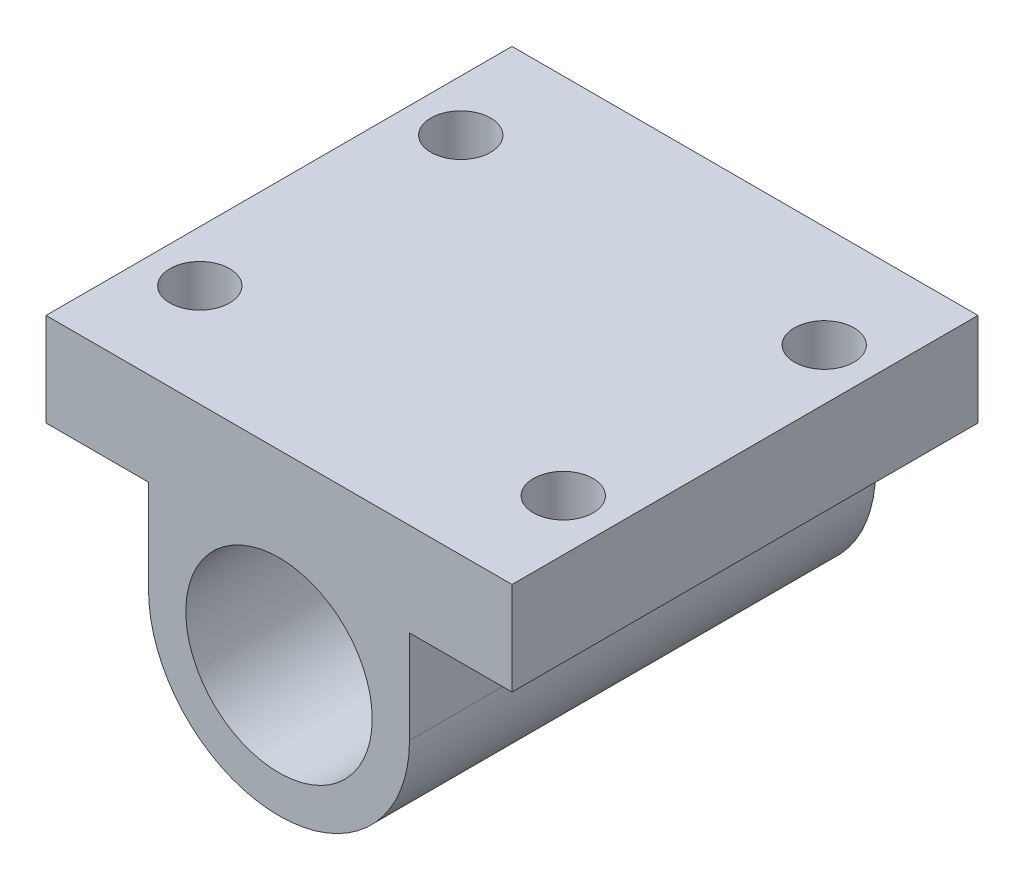
ISO-10303-21;
HEADER;
FILE_DESCRIPTION(('STEP AP214'),'2;1');
FILE_NAME('part.step','',(''),(''),'','','');
FILE_SCHEMA(('AUTOMOTIVE_DESIGN { 1 0 10303 214 1 1 1 1 }'));
ENDSEC;
DATA;
#1=APPLICATION_CONTEXT('core data for automotive mechanical design processes');
#2=APPLICATION_PROTOCOL_DEFINITION('international standard','automotive_design',2000,#1);
#3=PRODUCT_CONTEXT('',#1,'mechanical');
#4=PRODUCT('Part','Part','',(#3));
#5=PRODUCT_RELATED_PRODUCT_CATEGORY('part','',(#4));
#6=PRODUCT_DEFINITION_FORMATION('','',#4);
#7=PRODUCT_DEFINITION_CONTEXT('part definition',#1,'design');
#8=PRODUCT_DEFINITION('design','',#6,#7);
#9=PRODUCT_DEFINITION_SHAPE('','',#8);
#10=(LENGTH_UNIT() NAMED_UNIT(*) SI_UNIT(.MILLI.,.METRE.));
#11=(NAMED_UNIT(*) PLANE_ANGLE_UNIT() SI_UNIT($,.RADIAN.));
#12=(NAMED_UNIT(*) SI_UNIT($,.STERADIAN.) SOLID_ANGLE_UNIT());
#13=UNCERTAINTY_MEASURE_WITH_UNIT(LENGTH_MEASURE(1.E-05),#10,'distance_accuracy_value','');
#14=(GEOMETRIC_REPRESENTATION_CONTEXT(3) GLOBAL_UNCERTAINTY_ASSIGNED_CONTEXT((#13)) GLOBAL_UNIT_ASSIGNED_CONTEXT((#10,
#11,#12)) REPRESENTATION_CONTEXT('',''));
#15=CARTESIAN_POINT('',(0.,0.,0.));
#16=DIRECTION('',(0.,0.,1.));
#17=DIRECTION('',(1.,0.,0.));
#18=AXIS2_PLACEMENT_3D('',#15,#16,#17);
#19=CARTESIAN_POINT('',(0.,-5.,25.));
#20=DIRECTION('',(0.,0.,1.));
#21=DIRECTION('',(1.,0.,0.));
#22=AXIS2_PLACEMENT_3D('',#19,#20,#21);
#23=PLANE('',#22);
#24=DIRECTION('',(0.,-1.,0.));
#25=VECTOR('',#24,1.);
#26=CARTESIAN_POINT('',(-12.5,5.,25.));
#27=LINE('',#26,#25);
#28=CARTESIAN_POINT('',(-12.5,5.,25.));
#29=VERTEX_POINT('',#28);
#30=CARTESIAN_POINT('',(-12.5,0.,25.));
#31=VERTEX_POINT('',#30);
#32=EDGE_CURVE('E170',#29,#31,#27,.T.);
#33=ORIENTED_EDGE('',*,*,#32,.T.);
#34=DIRECTION('',(1.,0.,0.));
#35=VECTOR('',#34,1.);
#36=CARTESIAN_POINT('',(-12.5,0.,25.));
#37=LINE('',#36,#35);
#38=CARTESIAN_POINT('',(-7.,0.,25.));
#39=VERTEX_POINT('',#38);
#40=EDGE_CURVE('E106',#31,#39,#37,.T.);
#41=ORIENTED_EDGE('',*,*,#40,.T.);
#42=DIRECTION('',(0.,-1.,0.));
#43=VECTOR('',#42,1.);
#44=CARTESIAN_POINT('',(-7.,-5.,25.));
#45=LINE('',#44,#43);
#46=CARTESIAN_POINT('',(-7.,-5.,25.));
#47=VERTEX_POINT('',#46);
#48=EDGE_CURVE('E191',#39,#47,#45,.T.);
#49=ORIENTED_EDGE('',*,*,#48,.T.);
#50=CARTESIAN_POINT('',(0.,-5.,25.));
#51=DIRECTION('',(0.,0.,1.));
#52=DIRECTION('',(1.,0.,0.));
#53=AXIS2_PLACEMENT_3D('',#50,#51,#52);
#54=CIRCLE('',#53,7.);
#55=CARTESIAN_POINT('',(7.,-5.,25.));
#56=VERTEX_POINT('',#55);
#57=EDGE_CURVE('E205',#47,#56,#54,.T.);
#58=ORIENTED_EDGE('',*,*,#57,.T.);
#59=DIRECTION('',(0.,1.,0.));
#60=VECTOR('',#59,1.);
#61=CARTESIAN_POINT('',(7.,-5.,25.));
#62=LINE('',#61,#60);
#63=CARTESIAN_POINT('',(7.,0.,25.));
#64=VERTEX_POINT('',#63);
#65=EDGE_CURVE('E125',#56,#64,#62,.T.);
#66=ORIENTED_EDGE('',*,*,#65,.T.);
#67=DIRECTION('',(1.,0.,0.));
#68=VECTOR('',#67,1.);
#69=CARTESIAN_POINT('',(7.,0.,25.));
#70=LINE('',#69,#68);
#71=CARTESIAN_POINT('',(12.5,0.,25.));
#72=VERTEX_POINT('',#71);
#73=EDGE_CURVE('E119',#64,#72,#70,.T.);
#74=ORIENTED_EDGE('',*,*,#73,.T.);
#75=DIRECTION('',(0.,1.,0.));
#76=VECTOR('',#75,1.);
#77=CARTESIAN_POINT('',(12.5,5.,25.));
#78=LINE('',#77,#76);
#79=CARTESIAN_POINT('',(12.5,5.,25.));
#80=VERTEX_POINT('',#79);
#81=EDGE_CURVE('E123',#72,#80,#78,.T.);
#82=ORIENTED_EDGE('',*,*,#81,.T.);
#83=DIRECTION('',(-1.,0.,0.));
#84=VECTOR('',#83,1.);
#85=CARTESIAN_POINT('',(-12.5,5.,25.));
#86=LINE('',#85,#84);
#87=EDGE_CURVE('E63',#80,#29,#86,.T.);
#88=ORIENTED_EDGE('',*,*,#87,.T.);
#89=EDGE_LOOP('',(#33,#41,#49,#58,#66,#74,#82,#88));
#90=FACE_BOUND('',#89,.T.);
#91=CARTESIAN_POINT('',(0.,-5.,25.));
#92=DIRECTION('',(0.,0.,1.));
#93=DIRECTION('',(1.,0.,0.));
#94=AXIS2_PLACEMENT_3D('',#91,#92,#93);
#95=CIRCLE('',#94,5.);
#96=CARTESIAN_POINT('',(5.,-5.,25.));
#97=VERTEX_POINT('',#96);
#98=EDGE_CURVE('E152',#97,#97,#95,.T.);
#99=ORIENTED_EDGE('',*,*,#98,.F.);
#100=EDGE_LOOP('',(#99));
#101=FACE_BOUND('',#100,.T.);
#102=ADVANCED_FACE('F45',(#90,#101),#23,.T.);
#103=CARTESIAN_POINT('',(0.,-5.,0.));
#104=DIRECTION('',(0.,0.,1.));
#105=DIRECTION('',(1.,0.,0.));
#106=AXIS2_PLACEMENT_3D('',#103,#104,#105);
#107=PLANE('',#106);
#108=DIRECTION('',(0.,-1.,0.));
#109=VECTOR('',#108,1.);
#110=CARTESIAN_POINT('',(-12.5,5.,0.));
#111=LINE('',#110,#109);
#112=CARTESIAN_POINT('',(-12.5,5.,0.));
#113=VERTEX_POINT('',#112);
#114=CARTESIAN_POINT('',(-12.5,0.,0.));
#115=VERTEX_POINT('',#114);
#116=EDGE_CURVE('E147',#113,#115,#111,.T.);
#117=ORIENTED_EDGE('',*,*,#116,.F.);
#118=DIRECTION('',(-1.,0.,0.));
#119=VECTOR('',#118,1.);
#120=CARTESIAN_POINT('',(-12.5,5.,0.));
#121=LINE('',#120,#119);
#122=CARTESIAN_POINT('',(12.5,5.,0.));
#123=VERTEX_POINT('',#122);
#124=EDGE_CURVE('E98',#123,#113,#121,.T.);
#125=ORIENTED_EDGE('',*,*,#124,.F.);
#126=DIRECTION('',(0.,1.,0.));
#127=VECTOR('',#126,1.);
#128=CARTESIAN_POINT('',(12.5,5.,0.));
#129=LINE('',#128,#127);
#130=CARTESIAN_POINT('',(12.5,0.,0.));
#131=VERTEX_POINT('',#130);
#132=EDGE_CURVE('E92',#131,#123,#129,.T.);
#133=ORIENTED_EDGE('',*,*,#132,.F.);
#134=DIRECTION('',(1.,0.,0.));
#135=VECTOR('',#134,1.);
#136=CARTESIAN_POINT('',(7.,0.,0.));
#137=LINE('',#136,#135);
#138=CARTESIAN_POINT('',(7.,0.,0.));
#139=VERTEX_POINT('',#138);
#140=EDGE_CURVE('E134',#139,#131,#137,.T.);
#141=ORIENTED_EDGE('',*,*,#140,.F.);
#142=DIRECTION('',(0.,1.,0.));
#143=VECTOR('',#142,1.);
#144=CARTESIAN_POINT('',(7.,-5.,0.));
#145=LINE('',#144,#143);
#146=CARTESIAN_POINT('',(7.,-5.,0.));
#147=VERTEX_POINT('',#146);
#148=EDGE_CURVE('E161',#147,#139,#145,.T.);
#149=ORIENTED_EDGE('',*,*,#148,.F.);
#150=CARTESIAN_POINT('',(0.,-5.,0.));
#151=DIRECTION('',(0.,0.,1.));
#152=DIRECTION('',(1.,0.,0.));
#153=AXIS2_PLACEMENT_3D('',#150,#151,#152);
#154=CIRCLE('',#153,7.);
#155=CARTESIAN_POINT('',(-7.,-5.,0.));
#156=VERTEX_POINT('',#155);
#157=EDGE_CURVE('E158',#156,#147,#154,.T.);
#158=ORIENTED_EDGE('',*,*,#157,.F.);
#159=DIRECTION('',(0.,-1.,0.));
#160=VECTOR('',#159,1.);
#161=CARTESIAN_POINT('',(-7.,-5.,0.));
#162=LINE('',#161,#160);
#163=CARTESIAN_POINT('',(-7.,0.,0.));
#164=VERTEX_POINT('',#163);
#165=EDGE_CURVE('E155',#164,#156,#162,.T.);
#166=ORIENTED_EDGE('',*,*,#165,.F.);
#167=DIRECTION('',(1.,0.,0.));
#168=VECTOR('',#167,1.);
#169=CARTESIAN_POINT('',(-12.5,0.,0.));
#170=LINE('',#169,#168);
#171=EDGE_CURVE('E151',#115,#164,#170,.T.);
#172=ORIENTED_EDGE('',*,*,#171,.F.);
#173=EDGE_LOOP('',(#117,#125,#133,#141,#149,#158,#166,#172));
#174=FACE_BOUND('',#173,.T.);
#175=CARTESIAN_POINT('',(0.,-5.,0.));
#176=DIRECTION('',(0.,0.,1.));
#177=DIRECTION('',(1.,0.,0.));
#178=AXIS2_PLACEMENT_3D('',#175,#176,#177);
#179=CIRCLE('',#178,5.);
#180=CARTESIAN_POINT('',(5.,-5.,0.));
#181=VERTEX_POINT('',#180);
#182=EDGE_CURVE('E215',#181,#181,#179,.T.);
#183=ORIENTED_EDGE('',*,*,#182,.T.);
#184=EDGE_LOOP('',(#183));
#185=FACE_BOUND('',#184,.T.);
#186=ADVANCED_FACE('F195',(#174,#185),#107,.F.);
#187=CARTESIAN_POINT('',(-12.5,5.,25.));
#188=DIRECTION('',(1.,0.,0.));
#189=DIRECTION('',(0.,0.,-1.));
#190=AXIS2_PLACEMENT_3D('',#187,#188,#189);
#191=PLANE('',#190);
#192=ORIENTED_EDGE('',*,*,#116,.T.);
#193=DIRECTION('',(0.,0.,-1.));
#194=VECTOR('',#193,1.);
#195=CARTESIAN_POINT('',(-12.5,0.,25.));
#196=LINE('',#195,#194);
#197=EDGE_CURVE('E11',#31,#115,#196,.T.);
#198=ORIENTED_EDGE('',*,*,#197,.F.);
#199=ORIENTED_EDGE('',*,*,#32,.F.);
#200=DIRECTION('',(0.,0.,-1.));
#201=VECTOR('',#200,1.);
#202=CARTESIAN_POINT('',(-12.5,5.,25.));
#203=LINE('',#202,#201);
#204=EDGE_CURVE('E143',#29,#113,#203,.T.);
#205=ORIENTED_EDGE('',*,*,#204,.T.);
#206=EDGE_LOOP('',(#192,#198,#199,#205));
#207=FACE_BOUND('',#206,.T.);
#208=ADVANCED_FACE('F47',(#207),#191,.F.);
#209=CARTESIAN_POINT('',(-12.5,0.,25.));
#210=DIRECTION('',(0.,1.,0.));
#211=DIRECTION('',(0.,0.,1.));
#212=AXIS2_PLACEMENT_3D('',#209,#210,#211);
#213=PLANE('',#212);
#214=CARTESIAN_POINT('',(-9.75,0.,19.5));
#215=DIRECTION('',(0.,-1.,0.));
#216=DIRECTION('',(0.,0.,-1.));
#217=AXIS2_PLACEMENT_3D('',#214,#215,#216);
#218=CIRCLE('',#217,1.59999999999999);
#219=CARTESIAN_POINT('',(-9.75,0.,17.9));
#220=VERTEX_POINT('',#219);
#221=EDGE_CURVE('E250',#220,#220,#218,.T.);
#222=ORIENTED_EDGE('',*,*,#221,.F.);
#223=EDGE_LOOP('',(#222));
#224=FACE_BOUND('',#223,.T.);
#225=CARTESIAN_POINT('',(-9.75,0.,5.5));
#226=DIRECTION('',(0.,-1.,0.));
#227=DIRECTION('',(0.,0.,-1.));
#228=AXIS2_PLACEMENT_3D('',#225,#226,#227);
#229=CIRCLE('',#228,1.59999999999999);
#230=CARTESIAN_POINT('',(-9.75,0.,3.90000000000001));
#231=VERTEX_POINT('',#230);
#232=EDGE_CURVE('E242',#231,#231,#229,.T.);
#233=ORIENTED_EDGE('',*,*,#232,.F.);
#234=EDGE_LOOP('',(#233));
#235=FACE_BOUND('',#234,.T.);
#236=ORIENTED_EDGE('',*,*,#171,.T.);
#237=DIRECTION('',(0.,0.,-1.));
#238=VECTOR('',#237,1.);
#239=CARTESIAN_POINT('',(-7.,0.,25.));
#240=LINE('',#239,#238);
#241=EDGE_CURVE('E55',#39,#164,#240,.T.);
#242=ORIENTED_EDGE('',*,*,#241,.F.);
#243=ORIENTED_EDGE('',*,*,#40,.F.);
#244=ORIENTED_EDGE('',*,*,#197,.T.);
#245=EDGE_LOOP('',(#236,#242,#243,#244));
#246=FACE_BOUND('',#245,.T.);
#247=ADVANCED_FACE('F257',(#224,#235,#246),#213,.F.);
#248=CARTESIAN_POINT('',(-7.,-5.,25.));
#249=DIRECTION('',(1.,0.,0.));
#250=DIRECTION('',(0.,0.,-1.));
#251=AXIS2_PLACEMENT_3D('',#248,#249,#250);
#252=PLANE('',#251);
#253=ORIENTED_EDGE('',*,*,#165,.T.);
#254=DIRECTION('',(0.,0.,-1.));
#255=VECTOR('',#254,1.);
#256=CARTESIAN_POINT('',(-7.,-5.,25.));
#257=LINE('',#256,#255);
#258=EDGE_CURVE('E181',#47,#156,#257,.T.);
#259=ORIENTED_EDGE('',*,*,#258,.F.);
#260=ORIENTED_EDGE('',*,*,#48,.F.);
#261=ORIENTED_EDGE('',*,*,#241,.T.);
#262=EDGE_LOOP('',(#253,#259,#260,#261));
#263=FACE_BOUND('',#262,.T.);
#264=ADVANCED_FACE('F189',(#263),#252,.F.);
#265=CARTESIAN_POINT('',(0.,-5.,25.));
#266=DIRECTION('',(0.,0.,-1.));
#267=DIRECTION('',(-1.,0.,0.));
#268=AXIS2_PLACEMENT_3D('',#265,#266,#267);
#269=CYLINDRICAL_SURFACE('',#268,7.);
#270=ORIENTED_EDGE('',*,*,#157,.T.);
#271=DIRECTION('',(0.,0.,-1.));
#272=VECTOR('',#271,1.);
#273=CARTESIAN_POINT('',(7.,-5.,25.));
#274=LINE('',#273,#272);
#275=EDGE_CURVE('E177',#56,#147,#274,.T.);
#276=ORIENTED_EDGE('',*,*,#275,.F.);
#277=ORIENTED_EDGE('',*,*,#57,.F.);
#278=ORIENTED_EDGE('',*,*,#258,.T.);
#279=EDGE_LOOP('',(#270,#276,#277,#278));
#280=FACE_BOUND('',#279,.T.);
#281=ADVANCED_FACE('F200',(#280),#269,.T.);
#282=CARTESIAN_POINT('',(7.,-5.,25.));
#283=DIRECTION('',(-1.,0.,0.));
#284=DIRECTION('',(0.,-1.,0.));
#285=AXIS2_PLACEMENT_3D('',#282,#283,#284);
#286=PLANE('',#285);
#287=ORIENTED_EDGE('',*,*,#148,.T.);
#288=DIRECTION('',(0.,0.,-1.));
#289=VECTOR('',#288,1.);
#290=CARTESIAN_POINT('',(7.,0.,25.));
#291=LINE('',#290,#289);
#292=EDGE_CURVE('E136',#64,#139,#291,.T.);
#293=ORIENTED_EDGE('',*,*,#292,.F.);
#294=ORIENTED_EDGE('',*,*,#65,.F.);
#295=ORIENTED_EDGE('',*,*,#275,.T.);
#296=EDGE_LOOP('',(#287,#293,#294,#295));
#297=FACE_BOUND('',#296,.T.);
#298=ADVANCED_FACE('F203',(#297),#286,.F.);
#299=CARTESIAN_POINT('',(7.,0.,25.));
#300=DIRECTION('',(0.,1.,0.));
#301=DIRECTION('',(0.,0.,1.));
#302=AXIS2_PLACEMENT_3D('',#299,#300,#301);
#303=PLANE('',#302);
#304=CARTESIAN_POINT('',(9.75,0.,5.5));
#305=DIRECTION('',(0.,-1.,0.));
#306=DIRECTION('',(0.,0.,-1.));
#307=AXIS2_PLACEMENT_3D('',#304,#305,#306);
#308=CIRCLE('',#307,1.59999999999999);
#309=CARTESIAN_POINT('',(9.75,0.,3.90000000000001));
#310=VERTEX_POINT('',#309);
#311=EDGE_CURVE('E234',#310,#310,#308,.T.);
#312=ORIENTED_EDGE('',*,*,#311,.F.);
#313=EDGE_LOOP('',(#312));
#314=FACE_BOUND('',#313,.T.);
#315=CARTESIAN_POINT('',(9.75,0.,19.5));
#316=DIRECTION('',(0.,-1.,0.));
#317=DIRECTION('',(0.,0.,-1.));
#318=AXIS2_PLACEMENT_3D('',#315,#316,#317);
#319=CIRCLE('',#318,1.59999999999999);
#320=CARTESIAN_POINT('',(9.75,0.,17.9));
#321=VERTEX_POINT('',#320);
#322=EDGE_CURVE('E226',#321,#321,#319,.T.);
#323=ORIENTED_EDGE('',*,*,#322,.F.);
#324=EDGE_LOOP('',(#323));
#325=FACE_BOUND('',#324,.T.);
#326=ORIENTED_EDGE('',*,*,#140,.T.);
#327=DIRECTION('',(0.,0.,-1.));
#328=VECTOR('',#327,1.);
#329=CARTESIAN_POINT('',(12.5,0.,25.));
#330=LINE('',#329,#328);
#331=EDGE_CURVE('E131',#72,#131,#330,.T.);
#332=ORIENTED_EDGE('',*,*,#331,.F.);
#333=ORIENTED_EDGE('',*,*,#73,.F.);
#334=ORIENTED_EDGE('',*,*,#292,.T.);
#335=EDGE_LOOP('',(#326,#332,#333,#334));
#336=FACE_BOUND('',#335,.T.);
#337=ADVANCED_FACE('F132',(#314,#325,#336),#303,.F.);
#338=CARTESIAN_POINT('',(12.5,5.,25.));
#339=DIRECTION('',(-1.,0.,0.));
#340=DIRECTION('',(0.,0.,1.));
#341=AXIS2_PLACEMENT_3D('',#338,#339,#340);
#342=PLANE('',#341);
#343=ORIENTED_EDGE('',*,*,#132,.T.);
#344=DIRECTION('',(0.,0.,-1.));
#345=VECTOR('',#344,1.);
#346=CARTESIAN_POINT('',(12.5,5.,25.));
#347=LINE('',#346,#345);
#348=EDGE_CURVE('E137',#80,#123,#347,.T.);
#349=ORIENTED_EDGE('',*,*,#348,.F.);
#350=ORIENTED_EDGE('',*,*,#81,.F.);
#351=ORIENTED_EDGE('',*,*,#331,.T.);
#352=EDGE_LOOP('',(#343,#349,#350,#351));
#353=FACE_BOUND('',#352,.T.);
#354=ADVANCED_FACE('F139',(#353),#342,.F.);
#355=CARTESIAN_POINT('',(-12.5,5.,25.));
#356=DIRECTION('',(0.,-1.,0.));
#357=DIRECTION('',(0.,0.,-1.));
#358=AXIS2_PLACEMENT_3D('',#355,#356,#357);
#359=PLANE('',#358);
#360=CARTESIAN_POINT('',(-9.75,5.,19.5));
#361=DIRECTION('',(0.,-1.,0.));
#362=DIRECTION('',(0.,0.,-1.));
#363=AXIS2_PLACEMENT_3D('',#360,#361,#362);
#364=CIRCLE('',#363,1.59999999999999);
#365=CARTESIAN_POINT('',(-9.75,5.,17.9));
#366=VERTEX_POINT('',#365);
#367=EDGE_CURVE('E246',#366,#366,#364,.T.);
#368=ORIENTED_EDGE('',*,*,#367,.T.);
#369=EDGE_LOOP('',(#368));
#370=FACE_BOUND('',#369,.T.);
#371=CARTESIAN_POINT('',(-9.75,5.,5.5));
#372=DIRECTION('',(0.,-1.,0.));
#373=DIRECTION('',(0.,0.,-1.));
#374=AXIS2_PLACEMENT_3D('',#371,#372,#373);
#375=CIRCLE('',#374,1.59999999999999);
#376=CARTESIAN_POINT('',(-9.75,5.,3.90000000000001));
#377=VERTEX_POINT('',#376);
#378=EDGE_CURVE('E238',#377,#377,#375,.T.);
#379=ORIENTED_EDGE('',*,*,#378,.T.);
#380=EDGE_LOOP('',(#379));
#381=FACE_BOUND('',#380,.T.);
#382=CARTESIAN_POINT('',(9.75,5.,5.5));
#383=DIRECTION('',(0.,-1.,0.));
#384=DIRECTION('',(0.,0.,-1.));
#385=AXIS2_PLACEMENT_3D('',#382,#383,#384);
#386=CIRCLE('',#385,1.59999999999999);
#387=CARTESIAN_POINT('',(9.75,5.,3.90000000000001));
#388=VERTEX_POINT('',#387);
#389=EDGE_CURVE('E230',#388,#388,#386,.T.);
#390=ORIENTED_EDGE('',*,*,#389,.T.);
#391=EDGE_LOOP('',(#390));
#392=FACE_BOUND('',#391,.T.);
#393=CARTESIAN_POINT('',(9.75,5.,19.5));
#394=DIRECTION('',(0.,-1.,0.));
#395=DIRECTION('',(0.,0.,-1.));
#396=AXIS2_PLACEMENT_3D('',#393,#394,#395);
#397=CIRCLE('',#396,1.59999999999999);
#398=CARTESIAN_POINT('',(9.75,5.,17.9));
#399=VERTEX_POINT('',#398);
#400=EDGE_CURVE('E219',#399,#399,#397,.T.);
#401=ORIENTED_EDGE('',*,*,#400,.T.);
#402=EDGE_LOOP('',(#401));
#403=FACE_BOUND('',#402,.T.);
#404=ORIENTED_EDGE('',*,*,#124,.T.);
#405=ORIENTED_EDGE('',*,*,#204,.F.);
#406=ORIENTED_EDGE('',*,*,#87,.F.);
#407=ORIENTED_EDGE('',*,*,#348,.T.);
#408=EDGE_LOOP('',(#404,#405,#406,#407));
#409=FACE_BOUND('',#408,.T.);
#410=ADVANCED_FACE('F264',(#370,#381,#392,#403,#409),#359,.F.);
#411=CARTESIAN_POINT('',(0.,-5.,25.));
#412=DIRECTION('',(0.,0.,-1.));
#413=DIRECTION('',(-1.,0.,0.));
#414=AXIS2_PLACEMENT_3D('',#411,#412,#413);
#415=CYLINDRICAL_SURFACE('',#414,5.);
#416=ORIENTED_EDGE('',*,*,#98,.T.);
#417=EDGE_LOOP('',(#416));
#418=FACE_BOUND('',#417,.T.);
#419=ORIENTED_EDGE('',*,*,#182,.F.);
#420=EDGE_LOOP('',(#419));
#421=FACE_BOUND('',#420,.T.);
#422=ADVANCED_FACE('F266',(#418,#421),#415,.F.);
#423=CARTESIAN_POINT('',(9.75,0.,19.5));
#424=DIRECTION('',(0.,-1.,0.));
#425=DIRECTION('',(0.,0.,-1.));
#426=AXIS2_PLACEMENT_3D('',#423,#424,#425);
#427=CYLINDRICAL_SURFACE('',#426,1.59999999999999);
#428=ORIENTED_EDGE('',*,*,#400,.F.);
#429=EDGE_LOOP('',(#428));
#430=FACE_BOUND('',#429,.T.);
#431=ORIENTED_EDGE('',*,*,#322,.T.);
#432=EDGE_LOOP('',(#431));
#433=FACE_BOUND('',#432,.T.);
#434=ADVANCED_FACE('F274',(#430,#433),#427,.F.);
#435=CARTESIAN_POINT('',(9.75,0.,5.5));
#436=DIRECTION('',(0.,-1.,0.));
#437=DIRECTION('',(0.,0.,-1.));
#438=AXIS2_PLACEMENT_3D('',#435,#436,#437);
#439=CYLINDRICAL_SURFACE('',#438,1.59999999999999);
#440=ORIENTED_EDGE('',*,*,#389,.F.);
#441=EDGE_LOOP('',(#440));
#442=FACE_BOUND('',#441,.T.);
#443=ORIENTED_EDGE('',*,*,#311,.T.);
#444=EDGE_LOOP('',(#443));
#445=FACE_BOUND('',#444,.T.);
#446=ADVANCED_FACE('F288',(#442,#445),#439,.F.);
#447=CARTESIAN_POINT('',(-9.75,0.,5.5));
#448=DIRECTION('',(0.,-1.,0.));
#449=DIRECTION('',(0.,0.,-1.));
#450=AXIS2_PLACEMENT_3D('',#447,#448,#449);
#451=CYLINDRICAL_SURFACE('',#450,1.59999999999999);
#452=ORIENTED_EDGE('',*,*,#378,.F.);
#453=EDGE_LOOP('',(#452));
#454=FACE_BOUND('',#453,.T.);
#455=ORIENTED_EDGE('',*,*,#232,.T.);
#456=EDGE_LOOP('',(#455));
#457=FACE_BOUND('',#456,.T.);
#458=ADVANCED_FACE('F292',(#454,#457),#451,.F.);
#459=CARTESIAN_POINT('',(-9.75,0.,19.5));
#460=DIRECTION('',(0.,-1.,0.));
#461=DIRECTION('',(0.,0.,-1.));
#462=AXIS2_PLACEMENT_3D('',#459,#460,#461);
#463=CYLINDRICAL_SURFACE('',#462,1.59999999999999);
#464=ORIENTED_EDGE('',*,*,#367,.F.);
#465=EDGE_LOOP('',(#464));
#466=FACE_BOUND('',#465,.T.);
#467=ORIENTED_EDGE('',*,*,#221,.T.);
#468=EDGE_LOOP('',(#467));
#469=FACE_BOUND('',#468,.T.);
#470=ADVANCED_FACE('F255',(#466,#469),#463,.F.);
#471=CLOSED_SHELL('',(#102,#186,#208,#247,#264,#281,#298,#337,#354,#410,#422,#434,#446,#458,#470));
#472=MANIFOLD_SOLID_BREP('B2',#471);
#473=ADVANCED_BREP_SHAPE_REPRESENTATION('',(#18,#472),#14);
#474=SHAPE_DEFINITION_REPRESENTATION(#9,#473);
ENDSEC;
END-ISO-10303-21;
